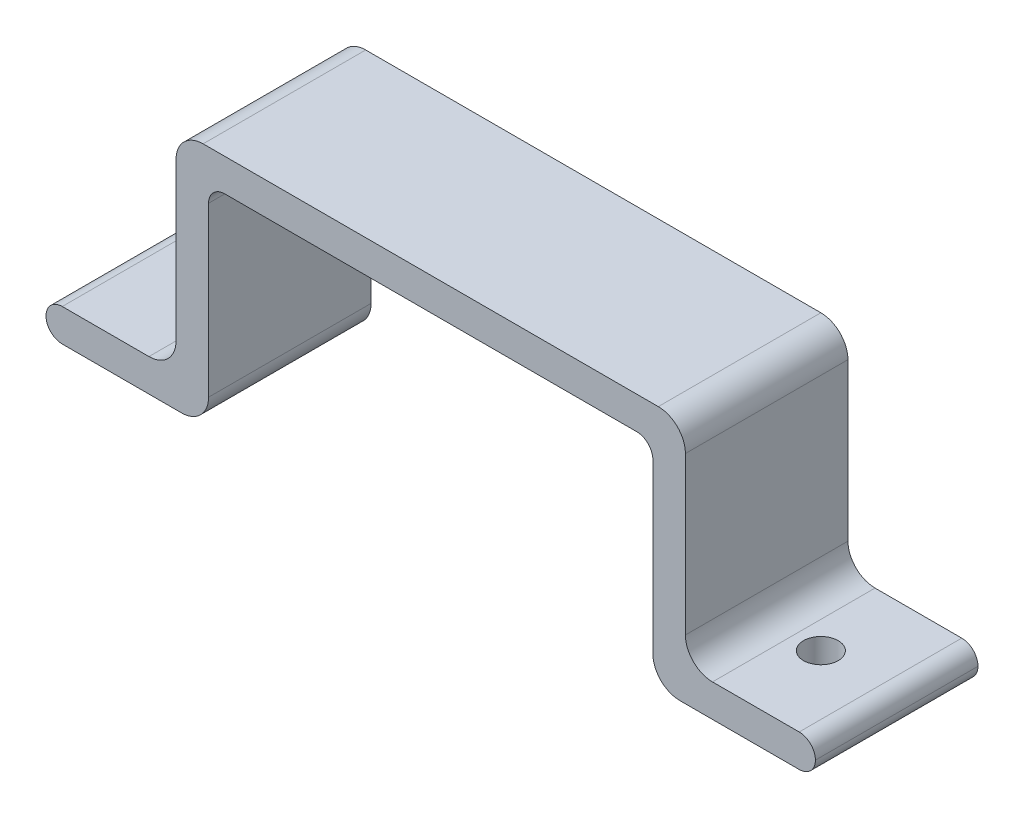
ISO-10303-21;
HEADER;
FILE_DESCRIPTION(('STEP AP214'),'2;1');
FILE_NAME('part.step','',(''),(''),'','','');
FILE_SCHEMA(('AUTOMOTIVE_DESIGN { 1 0 10303 214 1 1 1 1 }'));
ENDSEC;
DATA;
#1=APPLICATION_CONTEXT('core data for automotive mechanical design processes');
#2=APPLICATION_PROTOCOL_DEFINITION('international standard','automotive_design',2000,#1);
#3=PRODUCT_CONTEXT('',#1,'mechanical');
#4=PRODUCT('Part','Part','',(#3));
#5=PRODUCT_RELATED_PRODUCT_CATEGORY('part','',(#4));
#6=PRODUCT_DEFINITION_FORMATION('','',#4);
#7=PRODUCT_DEFINITION_CONTEXT('part definition',#1,'design');
#8=PRODUCT_DEFINITION('design','',#6,#7);
#9=PRODUCT_DEFINITION_SHAPE('','',#8);
#10=(LENGTH_UNIT() NAMED_UNIT(*) SI_UNIT(.MILLI.,.METRE.));
#11=(NAMED_UNIT(*) PLANE_ANGLE_UNIT() SI_UNIT($,.RADIAN.));
#12=(NAMED_UNIT(*) SI_UNIT($,.STERADIAN.) SOLID_ANGLE_UNIT());
#13=UNCERTAINTY_MEASURE_WITH_UNIT(LENGTH_MEASURE(1.E-05),#10,'distance_accuracy_value','');
#14=(GEOMETRIC_REPRESENTATION_CONTEXT(3) GLOBAL_UNCERTAINTY_ASSIGNED_CONTEXT((#13)) GLOBAL_UNIT_ASSIGNED_CONTEXT((#10,
#11,#12)) REPRESENTATION_CONTEXT('',''));
#15=CARTESIAN_POINT('',(0.,0.,0.));
#16=DIRECTION('',(0.,0.,1.));
#17=DIRECTION('',(1.,0.,0.));
#18=AXIS2_PLACEMENT_3D('',#15,#16,#17);
#19=CARTESIAN_POINT('',(23.5,12.75,7.5));
#20=DIRECTION('',(-1.,0.,0.));
#21=DIRECTION('',(0.,0.,1.));
#22=AXIS2_PLACEMENT_3D('',#19,#20,#21);
#23=PLANE('',#22);
#24=DIRECTION('',(0.,1.,0.));
#25=VECTOR('',#24,1.);
#26=CARTESIAN_POINT('',(23.5,12.75,-7.5));
#27=LINE('',#26,#25);
#28=CARTESIAN_POINT('',(23.5,-4.25,-7.5));
#29=VERTEX_POINT('',#28);
#30=CARTESIAN_POINT('',(23.5,10.25,-7.5));
#31=VERTEX_POINT('',#30);
#32=EDGE_CURVE('E231',#29,#31,#27,.T.);
#33=ORIENTED_EDGE('',*,*,#32,.T.);
#34=DIRECTION('',(0.,0.,-1.));
#35=VECTOR('',#34,1.);
#36=CARTESIAN_POINT('',(23.5,10.25,7.5));
#37=LINE('',#36,#35);
#38=CARTESIAN_POINT('',(23.5,10.25,7.5));
#39=VERTEX_POINT('',#38);
#40=EDGE_CURVE('E288',#31,#39,#37,.F.);
#41=ORIENTED_EDGE('',*,*,#40,.T.);
#42=DIRECTION('',(0.,1.,0.));
#43=VECTOR('',#42,1.);
#44=CARTESIAN_POINT('',(23.5,12.75,7.5));
#45=LINE('',#44,#43);
#46=CARTESIAN_POINT('',(23.5,-4.25,7.5));
#47=VERTEX_POINT('',#46);
#48=EDGE_CURVE('E254',#47,#39,#45,.T.);
#49=ORIENTED_EDGE('',*,*,#48,.F.);
#50=DIRECTION('',(0.,0.,-1.));
#51=VECTOR('',#50,1.);
#52=CARTESIAN_POINT('',(23.5,-4.25,-7.5));
#53=LINE('',#52,#51);
#54=EDGE_CURVE('E284',#47,#29,#53,.T.);
#55=ORIENTED_EDGE('',*,*,#54,.T.);
#56=EDGE_LOOP('',(#33,#41,#49,#55));
#57=FACE_BOUND('',#56,.T.);
#58=ADVANCED_FACE('F39',(#57),#23,.F.);
#59=CARTESIAN_POINT('',(-23.5,12.75,7.5));
#60=DIRECTION('',(0.,-1.,0.));
#61=DIRECTION('',(0.,0.,-1.));
#62=AXIS2_PLACEMENT_3D('',#59,#60,#61);
#63=PLANE('',#62);
#64=DIRECTION('',(-1.,0.,0.));
#65=VECTOR('',#64,1.);
#66=CARTESIAN_POINT('',(-23.5,12.75,-7.5));
#67=LINE('',#66,#65);
#68=CARTESIAN_POINT('',(21.,12.75,-7.5));
#69=VERTEX_POINT('',#68);
#70=CARTESIAN_POINT('',(-21.,12.75,-7.5));
#71=VERTEX_POINT('',#70);
#72=EDGE_CURVE('E224',#69,#71,#67,.T.);
#73=ORIENTED_EDGE('',*,*,#72,.T.);
#74=DIRECTION('',(0.,0.,-1.));
#75=VECTOR('',#74,1.);
#76=CARTESIAN_POINT('',(-21.,12.75,7.5));
#77=LINE('',#76,#75);
#78=CARTESIAN_POINT('',(-21.,12.75,7.5));
#79=VERTEX_POINT('',#78);
#80=EDGE_CURVE('E197',#71,#79,#77,.F.);
#81=ORIENTED_EDGE('',*,*,#80,.T.);
#82=DIRECTION('',(-1.,0.,0.));
#83=VECTOR('',#82,1.);
#84=CARTESIAN_POINT('',(-23.5,12.75,7.5));
#85=LINE('',#84,#83);
#86=CARTESIAN_POINT('',(21.,12.75,7.5));
#87=VERTEX_POINT('',#86);
#88=EDGE_CURVE('E418',#87,#79,#85,.T.);
#89=ORIENTED_EDGE('',*,*,#88,.F.);
#90=DIRECTION('',(0.,0.,-1.));
#91=VECTOR('',#90,1.);
#92=CARTESIAN_POINT('',(21.,12.75,7.5));
#93=LINE('',#92,#91);
#94=EDGE_CURVE('E203',#87,#69,#93,.T.);
#95=ORIENTED_EDGE('',*,*,#94,.T.);
#96=EDGE_LOOP('',(#73,#81,#89,#95));
#97=FACE_BOUND('',#96,.T.);
#98=ADVANCED_FACE('F473',(#97),#63,.F.);
#99=CARTESIAN_POINT('',(-23.5,-6.75,7.5));
#100=DIRECTION('',(1.,0.,0.));
#101=DIRECTION('',(0.,0.,-1.));
#102=AXIS2_PLACEMENT_3D('',#99,#100,#101);
#103=PLANE('',#102);
#104=DIRECTION('',(0.,-1.,0.));
#105=VECTOR('',#104,1.);
#106=CARTESIAN_POINT('',(-23.5,-6.75,7.5));
#107=LINE('',#106,#105);
#108=CARTESIAN_POINT('',(-23.5,10.25,7.5));
#109=VERTEX_POINT('',#108);
#110=CARTESIAN_POINT('',(-23.5,-4.25,7.5));
#111=VERTEX_POINT('',#110);
#112=EDGE_CURVE('E213',#109,#111,#107,.T.);
#113=ORIENTED_EDGE('',*,*,#112,.F.);
#114=DIRECTION('',(0.,0.,-1.));
#115=VECTOR('',#114,1.);
#116=CARTESIAN_POINT('',(-23.5,10.25,7.5));
#117=LINE('',#116,#115);
#118=CARTESIAN_POINT('',(-23.5,10.25,-7.5));
#119=VERTEX_POINT('',#118);
#120=EDGE_CURVE('E196',#109,#119,#117,.T.);
#121=ORIENTED_EDGE('',*,*,#120,.T.);
#122=DIRECTION('',(0.,-1.,0.));
#123=VECTOR('',#122,1.);
#124=CARTESIAN_POINT('',(-23.5,-6.75,-7.5));
#125=LINE('',#124,#123);
#126=CARTESIAN_POINT('',(-23.5,-4.25,-7.5));
#127=VERTEX_POINT('',#126);
#128=EDGE_CURVE('E210',#119,#127,#125,.T.);
#129=ORIENTED_EDGE('',*,*,#128,.T.);
#130=DIRECTION('',(0.,0.,-1.));
#131=VECTOR('',#130,1.);
#132=CARTESIAN_POINT('',(-23.5,-4.25,7.5));
#133=LINE('',#132,#131);
#134=EDGE_CURVE('E216',#127,#111,#133,.F.);
#135=ORIENTED_EDGE('',*,*,#134,.T.);
#136=EDGE_LOOP('',(#113,#121,#129,#135));
#137=FACE_BOUND('',#136,.T.);
#138=ADVANCED_FACE('F209',(#137),#103,.F.);
#139=CARTESIAN_POINT('',(-35.5,-6.75,7.5));
#140=DIRECTION('',(0.,-1.,0.));
#141=DIRECTION('',(1.,0.,0.));
#142=AXIS2_PLACEMENT_3D('',#139,#140,#141);
#143=PLANE('',#142);
#144=CARTESIAN_POINT('',(-28.5,-6.75000000000001,0.));
#145=DIRECTION('',(0.,1.,0.));
#146=DIRECTION('',(0.,0.,1.));
#147=AXIS2_PLACEMENT_3D('',#144,#145,#146);
#148=CIRCLE('',#147,1.6);
#149=CARTESIAN_POINT('',(-28.5,-6.75000000000001,1.6));
#150=VERTEX_POINT('',#149);
#151=EDGE_CURVE('E452',#150,#150,#148,.T.);
#152=ORIENTED_EDGE('',*,*,#151,.F.);
#153=EDGE_LOOP('',(#152));
#154=FACE_BOUND('',#153,.T.);
#155=DIRECTION('',(-1.,0.,0.));
#156=VECTOR('',#155,1.);
#157=CARTESIAN_POINT('',(-35.5,-6.75,-7.5));
#158=LINE('',#157,#156);
#159=CARTESIAN_POINT('',(-26.,-6.75,-7.5));
#160=VERTEX_POINT('',#159);
#161=CARTESIAN_POINT('',(-34.,-6.75,-7.5));
#162=VERTEX_POINT('',#161);
#163=EDGE_CURVE('E223',#160,#162,#158,.T.);
#164=ORIENTED_EDGE('',*,*,#163,.T.);
#165=DIRECTION('',(0.,0.,-1.));
#166=VECTOR('',#165,1.);
#167=CARTESIAN_POINT('',(-34.,-6.75,7.5));
#168=LINE('',#167,#166);
#169=CARTESIAN_POINT('',(-34.,-6.75,7.5));
#170=VERTEX_POINT('',#169);
#171=EDGE_CURVE('E374',#162,#170,#168,.F.);
#172=ORIENTED_EDGE('',*,*,#171,.T.);
#173=DIRECTION('',(-1.,0.,0.));
#174=VECTOR('',#173,1.);
#175=CARTESIAN_POINT('',(-35.5,-6.75,7.5));
#176=LINE('',#175,#174);
#177=CARTESIAN_POINT('',(-26.,-6.75,7.5));
#178=VERTEX_POINT('',#177);
#179=EDGE_CURVE('E411',#178,#170,#176,.T.);
#180=ORIENTED_EDGE('',*,*,#179,.F.);
#181=DIRECTION('',(0.,0.,-1.));
#182=VECTOR('',#181,1.);
#183=CARTESIAN_POINT('',(-26.,-6.75,-7.5));
#184=LINE('',#183,#182);
#185=EDGE_CURVE('E311',#178,#160,#184,.T.);
#186=ORIENTED_EDGE('',*,*,#185,.T.);
#187=EDGE_LOOP('',(#164,#172,#180,#186));
#188=FACE_BOUND('',#187,.T.);
#189=ADVANCED_FACE('F407',(#154,#188),#143,.F.);
#190=CARTESIAN_POINT('',(-20.5,-9.75,7.5));
#191=DIRECTION('',(0.,1.,0.));
#192=DIRECTION('',(-1.,0.,0.));
#193=AXIS2_PLACEMENT_3D('',#190,#191,#192);
#194=PLANE('',#193);
#195=CARTESIAN_POINT('',(-28.5,-9.75,0.));
#196=DIRECTION('',(0.,1.,0.));
#197=DIRECTION('',(0.,0.,1.));
#198=AXIS2_PLACEMENT_3D('',#195,#196,#197);
#199=CIRCLE('',#198,1.6);
#200=CARTESIAN_POINT('',(-28.5,-9.75,1.6));
#201=VERTEX_POINT('',#200);
#202=EDGE_CURVE('E446',#201,#201,#199,.T.);
#203=ORIENTED_EDGE('',*,*,#202,.T.);
#204=EDGE_LOOP('',(#203));
#205=FACE_BOUND('',#204,.T.);
#206=DIRECTION('',(1.,0.,0.));
#207=VECTOR('',#206,1.);
#208=CARTESIAN_POINT('',(-20.5,-9.75,7.5));
#209=LINE('',#208,#207);
#210=CARTESIAN_POINT('',(-34.,-9.75,7.5));
#211=VERTEX_POINT('',#210);
#212=CARTESIAN_POINT('',(-23.,-9.75,7.5));
#213=VERTEX_POINT('',#212);
#214=EDGE_CURVE('E422',#211,#213,#209,.T.);
#215=ORIENTED_EDGE('',*,*,#214,.F.);
#216=DIRECTION('',(0.,0.,-1.));
#217=VECTOR('',#216,1.);
#218=CARTESIAN_POINT('',(-34.,-9.75,7.5));
#219=LINE('',#218,#217);
#220=CARTESIAN_POINT('',(-34.,-9.75,-7.5));
#221=VERTEX_POINT('',#220);
#222=EDGE_CURVE('E370',#211,#221,#219,.T.);
#223=ORIENTED_EDGE('',*,*,#222,.T.);
#224=DIRECTION('',(1.,0.,0.));
#225=VECTOR('',#224,1.);
#226=CARTESIAN_POINT('',(-20.5,-9.75,-7.5));
#227=LINE('',#226,#225);
#228=CARTESIAN_POINT('',(-23.,-9.75,-7.5));
#229=VERTEX_POINT('',#228);
#230=EDGE_CURVE('E229',#221,#229,#227,.T.);
#231=ORIENTED_EDGE('',*,*,#230,.T.);
#232=DIRECTION('',(0.,0.,-1.));
#233=VECTOR('',#232,1.);
#234=CARTESIAN_POINT('',(-23.,-9.75,7.5));
#235=LINE('',#234,#233);
#236=EDGE_CURVE('E307',#229,#213,#235,.F.);
#237=ORIENTED_EDGE('',*,*,#236,.T.);
#238=EDGE_LOOP('',(#215,#223,#231,#237));
#239=FACE_BOUND('',#238,.T.);
#240=ADVANCED_FACE('F550',(#205,#239),#194,.F.);
#241=CARTESIAN_POINT('',(-20.5,9.75,7.5));
#242=DIRECTION('',(-1.,0.,0.));
#243=DIRECTION('',(0.,0.,1.));
#244=AXIS2_PLACEMENT_3D('',#241,#242,#243);
#245=PLANE('',#244);
#246=DIRECTION('',(0.,1.,0.));
#247=VECTOR('',#246,1.);
#248=CARTESIAN_POINT('',(-20.5,9.75,-7.5));
#249=LINE('',#248,#247);
#250=CARTESIAN_POINT('',(-20.5,-7.25,-7.5));
#251=VERTEX_POINT('',#250);
#252=CARTESIAN_POINT('',(-20.5,8.25,-7.5));
#253=VERTEX_POINT('',#252);
#254=EDGE_CURVE('E237',#251,#253,#249,.T.);
#255=ORIENTED_EDGE('',*,*,#254,.T.);
#256=DIRECTION('',(0.,0.,-1.));
#257=VECTOR('',#256,1.);
#258=CARTESIAN_POINT('',(-20.5,8.25,7.5));
#259=LINE('',#258,#257);
#260=CARTESIAN_POINT('',(-20.5,8.25,7.5));
#261=VERTEX_POINT('',#260);
#262=EDGE_CURVE('E367',#253,#261,#259,.F.);
#263=ORIENTED_EDGE('',*,*,#262,.T.);
#264=DIRECTION('',(0.,1.,0.));
#265=VECTOR('',#264,1.);
#266=CARTESIAN_POINT('',(-20.5,9.75,7.5));
#267=LINE('',#266,#265);
#268=CARTESIAN_POINT('',(-20.5,-7.25,7.5));
#269=VERTEX_POINT('',#268);
#270=EDGE_CURVE('E429',#269,#261,#267,.T.);
#271=ORIENTED_EDGE('',*,*,#270,.F.);
#272=DIRECTION('',(0.,0.,-1.));
#273=VECTOR('',#272,1.);
#274=CARTESIAN_POINT('',(-20.5,-7.25,7.5));
#275=LINE('',#274,#273);
#276=EDGE_CURVE('E303',#269,#251,#275,.T.);
#277=ORIENTED_EDGE('',*,*,#276,.T.);
#278=EDGE_LOOP('',(#255,#263,#271,#277));
#279=FACE_BOUND('',#278,.T.);
#280=ADVANCED_FACE('F527',(#279),#245,.F.);
#281=CARTESIAN_POINT('',(20.5,9.75,7.5));
#282=DIRECTION('',(0.,1.,0.));
#283=DIRECTION('',(0.,0.,1.));
#284=AXIS2_PLACEMENT_3D('',#281,#282,#283);
#285=PLANE('',#284);
#286=DIRECTION('',(1.,0.,0.));
#287=VECTOR('',#286,1.);
#288=CARTESIAN_POINT('',(20.5,9.75,-7.5));
#289=LINE('',#288,#287);
#290=CARTESIAN_POINT('',(-19.,9.75,-7.5));
#291=VERTEX_POINT('',#290);
#292=CARTESIAN_POINT('',(19.,9.75,-7.5));
#293=VERTEX_POINT('',#292);
#294=EDGE_CURVE('E241',#291,#293,#289,.T.);
#295=ORIENTED_EDGE('',*,*,#294,.T.);
#296=DIRECTION('',(0.,0.,-1.));
#297=VECTOR('',#296,1.);
#298=CARTESIAN_POINT('',(19.,9.75,7.5));
#299=LINE('',#298,#297);
#300=CARTESIAN_POINT('',(19.,9.75,7.5));
#301=VERTEX_POINT('',#300);
#302=EDGE_CURVE('E364',#293,#301,#299,.F.);
#303=ORIENTED_EDGE('',*,*,#302,.T.);
#304=DIRECTION('',(1.,0.,0.));
#305=VECTOR('',#304,1.);
#306=CARTESIAN_POINT('',(20.5,9.75,7.5));
#307=LINE('',#306,#305);
#308=CARTESIAN_POINT('',(-19.,9.75,7.5));
#309=VERTEX_POINT('',#308);
#310=EDGE_CURVE('E433',#309,#301,#307,.T.);
#311=ORIENTED_EDGE('',*,*,#310,.F.);
#312=DIRECTION('',(0.,0.,-1.));
#313=VECTOR('',#312,1.);
#314=CARTESIAN_POINT('',(-19.,9.75,-7.5));
#315=LINE('',#314,#313);
#316=EDGE_CURVE('E360',#309,#291,#315,.T.);
#317=ORIENTED_EDGE('',*,*,#316,.T.);
#318=EDGE_LOOP('',(#295,#303,#311,#317));
#319=FACE_BOUND('',#318,.T.);
#320=ADVANCED_FACE('F536',(#319),#285,.F.);
#321=CARTESIAN_POINT('',(20.5,-9.75,7.5));
#322=DIRECTION('',(1.,0.,0.));
#323=DIRECTION('',(0.,1.,0.));
#324=AXIS2_PLACEMENT_3D('',#321,#322,#323);
#325=PLANE('',#324);
#326=DIRECTION('',(0.,-1.,0.));
#327=VECTOR('',#326,1.);
#328=CARTESIAN_POINT('',(20.5,-9.75,7.5));
#329=LINE('',#328,#327);
#330=CARTESIAN_POINT('',(20.5,8.25,7.5));
#331=VERTEX_POINT('',#330);
#332=CARTESIAN_POINT('',(20.5,-7.25,7.5));
#333=VERTEX_POINT('',#332);
#334=EDGE_CURVE('E437',#331,#333,#329,.T.);
#335=ORIENTED_EDGE('',*,*,#334,.F.);
#336=DIRECTION('',(0.,0.,-1.));
#337=VECTOR('',#336,1.);
#338=CARTESIAN_POINT('',(20.5,8.25,-7.5));
#339=LINE('',#338,#337);
#340=CARTESIAN_POINT('',(20.5,8.25,-7.5));
#341=VERTEX_POINT('',#340);
#342=EDGE_CURVE('E356',#331,#341,#339,.T.);
#343=ORIENTED_EDGE('',*,*,#342,.T.);
#344=DIRECTION('',(0.,-1.,0.));
#345=VECTOR('',#344,1.);
#346=CARTESIAN_POINT('',(20.5,-9.75,-7.5));
#347=LINE('',#346,#345);
#348=CARTESIAN_POINT('',(20.5,-7.25,-7.5));
#349=VERTEX_POINT('',#348);
#350=EDGE_CURVE('E245',#341,#349,#347,.T.);
#351=ORIENTED_EDGE('',*,*,#350,.T.);
#352=DIRECTION('',(0.,0.,-1.));
#353=VECTOR('',#352,1.);
#354=CARTESIAN_POINT('',(20.5,-7.25,7.5));
#355=LINE('',#354,#353);
#356=EDGE_CURVE('E295',#349,#333,#355,.F.);
#357=ORIENTED_EDGE('',*,*,#356,.T.);
#358=EDGE_LOOP('',(#335,#343,#351,#357));
#359=FACE_BOUND('',#358,.T.);
#360=ADVANCED_FACE('F543',(#359),#325,.F.);
#361=CARTESIAN_POINT('',(35.5,-9.75,7.5));
#362=DIRECTION('',(0.,1.,0.));
#363=DIRECTION('',(-1.,0.,0.));
#364=AXIS2_PLACEMENT_3D('',#361,#362,#363);
#365=PLANE('',#364);
#366=CARTESIAN_POINT('',(28.5,-9.75,0.));
#367=DIRECTION('',(0.,1.,0.));
#368=DIRECTION('',(0.,0.,1.));
#369=AXIS2_PLACEMENT_3D('',#366,#367,#368);
#370=CIRCLE('',#369,1.6);
#371=CARTESIAN_POINT('',(28.5,-9.75,1.6));
#372=VERTEX_POINT('',#371);
#373=EDGE_CURVE('E393',#372,#372,#370,.T.);
#374=ORIENTED_EDGE('',*,*,#373,.T.);
#375=EDGE_LOOP('',(#374));
#376=FACE_BOUND('',#375,.T.);
#377=DIRECTION('',(1.,0.,0.));
#378=VECTOR('',#377,1.);
#379=CARTESIAN_POINT('',(35.5,-9.75,-7.5));
#380=LINE('',#379,#378);
#381=CARTESIAN_POINT('',(23.,-9.75,-7.5));
#382=VERTEX_POINT('',#381);
#383=CARTESIAN_POINT('',(34.,-9.75,-7.5));
#384=VERTEX_POINT('',#383);
#385=EDGE_CURVE('E248',#382,#384,#380,.T.);
#386=ORIENTED_EDGE('',*,*,#385,.T.);
#387=DIRECTION('',(0.,0.,-1.));
#388=VECTOR('',#387,1.);
#389=CARTESIAN_POINT('',(34.,-9.75,7.5));
#390=LINE('',#389,#388);
#391=CARTESIAN_POINT('',(34.,-9.75,7.5));
#392=VERTEX_POINT('',#391);
#393=EDGE_CURVE('E65',#384,#392,#390,.F.);
#394=ORIENTED_EDGE('',*,*,#393,.T.);
#395=DIRECTION('',(1.,0.,0.));
#396=VECTOR('',#395,1.);
#397=CARTESIAN_POINT('',(35.5,-9.75,7.5));
#398=LINE('',#397,#396);
#399=CARTESIAN_POINT('',(23.,-9.75,7.5));
#400=VERTEX_POINT('',#399);
#401=EDGE_CURVE('E440',#400,#392,#398,.T.);
#402=ORIENTED_EDGE('',*,*,#401,.F.);
#403=DIRECTION('',(0.,0.,-1.));
#404=VECTOR('',#403,1.);
#405=CARTESIAN_POINT('',(23.,-9.75,7.5));
#406=LINE('',#405,#404);
#407=EDGE_CURVE('E291',#400,#382,#406,.T.);
#408=ORIENTED_EDGE('',*,*,#407,.T.);
#409=EDGE_LOOP('',(#386,#394,#402,#408));
#410=FACE_BOUND('',#409,.T.);
#411=ADVANCED_FACE('F548',(#376,#410),#365,.F.);
#412=CARTESIAN_POINT('',(23.5,-6.75,7.5));
#413=DIRECTION('',(0.,-1.,0.));
#414=DIRECTION('',(1.,0.,0.));
#415=AXIS2_PLACEMENT_3D('',#412,#413,#414);
#416=PLANE('',#415);
#417=CARTESIAN_POINT('',(28.5,-6.75000000000001,0.));
#418=DIRECTION('',(0.,1.,0.));
#419=DIRECTION('',(0.,0.,1.));
#420=AXIS2_PLACEMENT_3D('',#417,#418,#419);
#421=CIRCLE('',#420,1.6);
#422=CARTESIAN_POINT('',(28.5,-6.75000000000001,1.6));
#423=VERTEX_POINT('',#422);
#424=EDGE_CURVE('E387',#423,#423,#421,.T.);
#425=ORIENTED_EDGE('',*,*,#424,.F.);
#426=EDGE_LOOP('',(#425));
#427=FACE_BOUND('',#426,.T.);
#428=DIRECTION('',(-1.,0.,0.));
#429=VECTOR('',#428,1.);
#430=CARTESIAN_POINT('',(23.5,-6.75,7.5));
#431=LINE('',#430,#429);
#432=CARTESIAN_POINT('',(34.,-6.75,7.5));
#433=VERTEX_POINT('',#432);
#434=CARTESIAN_POINT('',(26.,-6.75,7.5));
#435=VERTEX_POINT('',#434);
#436=EDGE_CURVE('E256',#433,#435,#431,.T.);
#437=ORIENTED_EDGE('',*,*,#436,.F.);
#438=DIRECTION('',(0.,0.,-1.));
#439=VECTOR('',#438,1.);
#440=CARTESIAN_POINT('',(34.,-6.75,7.5));
#441=LINE('',#440,#439);
#442=CARTESIAN_POINT('',(34.,-6.75,-7.5));
#443=VERTEX_POINT('',#442);
#444=EDGE_CURVE('E327',#433,#443,#441,.T.);
#445=ORIENTED_EDGE('',*,*,#444,.T.);
#446=DIRECTION('',(-1.,0.,0.));
#447=VECTOR('',#446,1.);
#448=CARTESIAN_POINT('',(23.5,-6.75,-7.5));
#449=LINE('',#448,#447);
#450=CARTESIAN_POINT('',(26.,-6.75,-7.5));
#451=VERTEX_POINT('',#450);
#452=EDGE_CURVE('E251',#443,#451,#449,.T.);
#453=ORIENTED_EDGE('',*,*,#452,.T.);
#454=DIRECTION('',(0.,0.,-1.));
#455=VECTOR('',#454,1.);
#456=CARTESIAN_POINT('',(26.,-6.75,7.5));
#457=LINE('',#456,#455);
#458=EDGE_CURVE('E299',#451,#435,#457,.F.);
#459=ORIENTED_EDGE('',*,*,#458,.T.);
#460=EDGE_LOOP('',(#437,#445,#453,#459));
#461=FACE_BOUND('',#460,.T.);
#462=ADVANCED_FACE('F479',(#427,#461),#416,.F.);
#463=CARTESIAN_POINT('',(0.,0.,7.5));
#464=DIRECTION('',(0.,0.,1.));
#465=DIRECTION('',(1.,0.,0.));
#466=AXIS2_PLACEMENT_3D('',#463,#464,#465);
#467=PLANE('',#466);
#468=CARTESIAN_POINT('',(34.,-8.25,7.5));
#469=DIRECTION('',(0.,0.,1.));
#470=DIRECTION('',(1.,0.,0.));
#471=AXIS2_PLACEMENT_3D('',#468,#469,#470);
#472=CIRCLE('',#471,1.5);
#473=CARTESIAN_POINT('',(35.5,-8.25,7.5));
#474=VERTEX_POINT('',#473);
#475=EDGE_CURVE('E57',#392,#474,#472,.T.);
#476=ORIENTED_EDGE('',*,*,#475,.T.);
#477=CARTESIAN_POINT('',(34.,-8.25,7.5));
#478=DIRECTION('',(0.,0.,1.));
#479=DIRECTION('',(1.,0.,0.));
#480=AXIS2_PLACEMENT_3D('',#477,#478,#479);
#481=CIRCLE('',#480,1.5);
#482=EDGE_CURVE('E351',#474,#433,#481,.T.);
#483=ORIENTED_EDGE('',*,*,#482,.T.);
#484=ORIENTED_EDGE('',*,*,#436,.T.);
#485=CARTESIAN_POINT('',(26.,-4.25,7.5));
#486=DIRECTION('',(0.,0.,1.));
#487=DIRECTION('',(1.,0.,0.));
#488=AXIS2_PLACEMENT_3D('',#485,#486,#487);
#489=CIRCLE('',#488,2.5);
#490=EDGE_CURVE('E319',#435,#47,#489,.F.);
#491=ORIENTED_EDGE('',*,*,#490,.T.);
#492=ORIENTED_EDGE('',*,*,#48,.T.);
#493=CARTESIAN_POINT('',(21.,10.25,7.5));
#494=DIRECTION('',(0.,0.,1.));
#495=DIRECTION('',(1.,0.,0.));
#496=AXIS2_PLACEMENT_3D('',#493,#494,#495);
#497=CIRCLE('',#496,2.5);
#498=EDGE_CURVE('E278',#39,#87,#497,.T.);
#499=ORIENTED_EDGE('',*,*,#498,.T.);
#500=ORIENTED_EDGE('',*,*,#88,.T.);
#501=CARTESIAN_POINT('',(-21.,10.25,7.5));
#502=DIRECTION('',(0.,0.,1.));
#503=DIRECTION('',(1.,0.,0.));
#504=AXIS2_PLACEMENT_3D('',#501,#502,#503);
#505=CIRCLE('',#504,2.5);
#506=EDGE_CURVE('E281',#79,#109,#505,.T.);
#507=ORIENTED_EDGE('',*,*,#506,.T.);
#508=ORIENTED_EDGE('',*,*,#112,.T.);
#509=CARTESIAN_POINT('',(-26.,-4.25,7.5));
#510=DIRECTION('',(0.,0.,1.));
#511=DIRECTION('',(1.,0.,0.));
#512=AXIS2_PLACEMENT_3D('',#509,#510,#511);
#513=CIRCLE('',#512,2.5);
#514=EDGE_CURVE('E324',#111,#178,#513,.F.);
#515=ORIENTED_EDGE('',*,*,#514,.T.);
#516=ORIENTED_EDGE('',*,*,#179,.T.);
#517=CARTESIAN_POINT('',(-34.,-8.24999999999999,7.5));
#518=DIRECTION('',(0.,0.,1.));
#519=DIRECTION('',(1.,0.,0.));
#520=AXIS2_PLACEMENT_3D('',#517,#518,#519);
#521=CIRCLE('',#520,1.5);
#522=CARTESIAN_POINT('',(-35.5,-8.24999999999999,7.5));
#523=VERTEX_POINT('',#522);
#524=EDGE_CURVE('E343',#170,#523,#521,.T.);
#525=ORIENTED_EDGE('',*,*,#524,.T.);
#526=CARTESIAN_POINT('',(-34.,-8.25,7.5));
#527=DIRECTION('',(0.,0.,1.));
#528=DIRECTION('',(1.,0.,0.));
#529=AXIS2_PLACEMENT_3D('',#526,#527,#528);
#530=CIRCLE('',#529,1.5);
#531=EDGE_CURVE('E346',#523,#211,#530,.T.);
#532=ORIENTED_EDGE('',*,*,#531,.T.);
#533=ORIENTED_EDGE('',*,*,#214,.T.);
#534=CARTESIAN_POINT('',(-23.,-7.25,7.5));
#535=DIRECTION('',(0.,0.,1.));
#536=DIRECTION('',(1.,0.,0.));
#537=AXIS2_PLACEMENT_3D('',#534,#535,#536);
#538=CIRCLE('',#537,2.5);
#539=EDGE_CURVE('E272',#213,#269,#538,.T.);
#540=ORIENTED_EDGE('',*,*,#539,.T.);
#541=ORIENTED_EDGE('',*,*,#270,.T.);
#542=CARTESIAN_POINT('',(-19.,8.25,7.5));
#543=DIRECTION('',(0.,0.,1.));
#544=DIRECTION('',(1.,0.,0.));
#545=AXIS2_PLACEMENT_3D('',#542,#543,#544);
#546=CIRCLE('',#545,1.5);
#547=EDGE_CURVE('E11',#261,#309,#546,.F.);
#548=ORIENTED_EDGE('',*,*,#547,.T.);
#549=ORIENTED_EDGE('',*,*,#310,.T.);
#550=CARTESIAN_POINT('',(19.,8.25,7.5));
#551=DIRECTION('',(0.,0.,1.));
#552=DIRECTION('',(1.,0.,0.));
#553=AXIS2_PLACEMENT_3D('',#550,#551,#552);
#554=CIRCLE('',#553,1.5);
#555=EDGE_CURVE('E380',#301,#331,#554,.F.);
#556=ORIENTED_EDGE('',*,*,#555,.T.);
#557=ORIENTED_EDGE('',*,*,#334,.T.);
#558=CARTESIAN_POINT('',(23.,-7.25,7.5));
#559=DIRECTION('',(0.,0.,1.));
#560=DIRECTION('',(1.,0.,0.));
#561=AXIS2_PLACEMENT_3D('',#558,#559,#560);
#562=CIRCLE('',#561,2.5);
#563=EDGE_CURVE('E275',#333,#400,#562,.T.);
#564=ORIENTED_EDGE('',*,*,#563,.T.);
#565=ORIENTED_EDGE('',*,*,#401,.T.);
#566=EDGE_LOOP('',(#476,#483,#484,#491,#492,#499,#500,#507,#508,#515,#516,#525,#532,#533,#540,
#541,#548,#549,#556,#557,#564,#565));
#567=FACE_BOUND('',#566,.T.);
#568=ADVANCED_FACE('F415',(#567),#467,.T.);
#569=CARTESIAN_POINT('',(0.,0.,-7.5));
#570=DIRECTION('',(0.,0.,1.));
#571=DIRECTION('',(1.,0.,0.));
#572=AXIS2_PLACEMENT_3D('',#569,#570,#571);
#573=PLANE('',#572);
#574=ORIENTED_EDGE('',*,*,#452,.F.);
#575=CARTESIAN_POINT('',(34.,-8.25,-7.5));
#576=DIRECTION('',(0.,0.,1.));
#577=DIRECTION('',(1.,0.,0.));
#578=AXIS2_PLACEMENT_3D('',#575,#576,#577);
#579=CIRCLE('',#578,1.5);
#580=CARTESIAN_POINT('',(35.5,-8.25,-7.5));
#581=VERTEX_POINT('',#580);
#582=EDGE_CURVE('E340',#443,#581,#579,.F.);
#583=ORIENTED_EDGE('',*,*,#582,.T.);
#584=CARTESIAN_POINT('',(34.,-8.25,-7.5));
#585=DIRECTION('',(0.,0.,1.));
#586=DIRECTION('',(1.,0.,0.));
#587=AXIS2_PLACEMENT_3D('',#584,#585,#586);
#588=CIRCLE('',#587,1.5);
#589=EDGE_CURVE('E337',#581,#384,#588,.F.);
#590=ORIENTED_EDGE('',*,*,#589,.T.);
#591=ORIENTED_EDGE('',*,*,#385,.F.);
#592=CARTESIAN_POINT('',(23.,-7.25,-7.5));
#593=DIRECTION('',(0.,0.,1.));
#594=DIRECTION('',(1.,0.,0.));
#595=AXIS2_PLACEMENT_3D('',#592,#593,#594);
#596=CIRCLE('',#595,2.5);
#597=EDGE_CURVE('E261',#382,#349,#596,.F.);
#598=ORIENTED_EDGE('',*,*,#597,.T.);
#599=ORIENTED_EDGE('',*,*,#350,.F.);
#600=CARTESIAN_POINT('',(19.,8.25,-7.5));
#601=DIRECTION('',(0.,0.,1.));
#602=DIRECTION('',(1.,0.,0.));
#603=AXIS2_PLACEMENT_3D('',#600,#601,#602);
#604=CIRCLE('',#603,1.5);
#605=EDGE_CURVE('E377',#341,#293,#604,.T.);
#606=ORIENTED_EDGE('',*,*,#605,.T.);
#607=ORIENTED_EDGE('',*,*,#294,.F.);
#608=CARTESIAN_POINT('',(-19.,8.25,-7.5));
#609=DIRECTION('',(0.,0.,1.));
#610=DIRECTION('',(1.,0.,0.));
#611=AXIS2_PLACEMENT_3D('',#608,#609,#610);
#612=CIRCLE('',#611,1.5);
#613=EDGE_CURVE('E49',#291,#253,#612,.T.);
#614=ORIENTED_EDGE('',*,*,#613,.T.);
#615=ORIENTED_EDGE('',*,*,#254,.F.);
#616=CARTESIAN_POINT('',(-23.,-7.25,-7.5));
#617=DIRECTION('',(0.,0.,1.));
#618=DIRECTION('',(1.,0.,0.));
#619=AXIS2_PLACEMENT_3D('',#616,#617,#618);
#620=CIRCLE('',#619,2.5);
#621=EDGE_CURVE('E215',#251,#229,#620,.F.);
#622=ORIENTED_EDGE('',*,*,#621,.T.);
#623=ORIENTED_EDGE('',*,*,#230,.F.);
#624=CARTESIAN_POINT('',(-34.,-8.25,-7.5));
#625=DIRECTION('',(0.,0.,1.));
#626=DIRECTION('',(1.,0.,0.));
#627=AXIS2_PLACEMENT_3D('',#624,#625,#626);
#628=CIRCLE('',#627,1.5);
#629=CARTESIAN_POINT('',(-35.5,-8.24999999999999,-7.5));
#630=VERTEX_POINT('',#629);
#631=EDGE_CURVE('E334',#221,#630,#628,.F.);
#632=ORIENTED_EDGE('',*,*,#631,.T.);
#633=CARTESIAN_POINT('',(-34.,-8.24999999999999,-7.5));
#634=DIRECTION('',(0.,0.,1.));
#635=DIRECTION('',(1.,0.,0.));
#636=AXIS2_PLACEMENT_3D('',#633,#634,#635);
#637=CIRCLE('',#636,1.5);
#638=EDGE_CURVE('E331',#630,#162,#637,.F.);
#639=ORIENTED_EDGE('',*,*,#638,.T.);
#640=ORIENTED_EDGE('',*,*,#163,.F.);
#641=CARTESIAN_POINT('',(-26.,-4.25,-7.5));
#642=DIRECTION('',(0.,0.,1.));
#643=DIRECTION('',(1.,0.,0.));
#644=AXIS2_PLACEMENT_3D('',#641,#642,#643);
#645=CIRCLE('',#644,2.5);
#646=EDGE_CURVE('E221',#160,#127,#645,.T.);
#647=ORIENTED_EDGE('',*,*,#646,.T.);
#648=ORIENTED_EDGE('',*,*,#128,.F.);
#649=CARTESIAN_POINT('',(-21.,10.25,-7.5));
#650=DIRECTION('',(0.,0.,1.));
#651=DIRECTION('',(1.,0.,0.));
#652=AXIS2_PLACEMENT_3D('',#649,#650,#651);
#653=CIRCLE('',#652,2.5);
#654=EDGE_CURVE('E192',#119,#71,#653,.F.);
#655=ORIENTED_EDGE('',*,*,#654,.T.);
#656=ORIENTED_EDGE('',*,*,#72,.F.);
#657=CARTESIAN_POINT('',(21.,10.25,-7.5));
#658=DIRECTION('',(0.,0.,1.));
#659=DIRECTION('',(1.,0.,0.));
#660=AXIS2_PLACEMENT_3D('',#657,#658,#659);
#661=CIRCLE('',#660,2.5);
#662=EDGE_CURVE('E204',#69,#31,#661,.F.);
#663=ORIENTED_EDGE('',*,*,#662,.T.);
#664=ORIENTED_EDGE('',*,*,#32,.F.);
#665=CARTESIAN_POINT('',(26.,-4.25,-7.5));
#666=DIRECTION('',(0.,0.,1.));
#667=DIRECTION('',(1.,0.,0.));
#668=AXIS2_PLACEMENT_3D('',#665,#666,#667);
#669=CIRCLE('',#668,2.5);
#670=EDGE_CURVE('E315',#29,#451,#669,.T.);
#671=ORIENTED_EDGE('',*,*,#670,.T.);
#672=EDGE_LOOP('',(#574,#583,#590,#591,#598,#599,#606,#607,#614,#615,#622,#623,#632,#639,#640,
#647,#648,#655,#656,#663,#664,#671));
#673=FACE_BOUND('',#672,.T.);
#674=ADVANCED_FACE('F219',(#673),#573,.F.);
#675=CARTESIAN_POINT('',(28.5,-9.75,0.));
#676=DIRECTION('',(0.,1.,0.));
#677=DIRECTION('',(0.,0.,1.));
#678=AXIS2_PLACEMENT_3D('',#675,#676,#677);
#679=CYLINDRICAL_SURFACE('',#678,1.6);
#680=ORIENTED_EDGE('',*,*,#373,.F.);
#681=EDGE_LOOP('',(#680));
#682=FACE_BOUND('',#681,.T.);
#683=ORIENTED_EDGE('',*,*,#424,.T.);
#684=EDGE_LOOP('',(#683));
#685=FACE_BOUND('',#684,.T.);
#686=ADVANCED_FACE('F633',(#682,#685),#679,.F.);
#687=CARTESIAN_POINT('',(-28.5,-9.75,0.));
#688=DIRECTION('',(0.,1.,0.));
#689=DIRECTION('',(0.,0.,1.));
#690=AXIS2_PLACEMENT_3D('',#687,#688,#689);
#691=CYLINDRICAL_SURFACE('',#690,1.6);
#692=ORIENTED_EDGE('',*,*,#202,.F.);
#693=EDGE_LOOP('',(#692));
#694=FACE_BOUND('',#693,.T.);
#695=ORIENTED_EDGE('',*,*,#151,.T.);
#696=EDGE_LOOP('',(#695));
#697=FACE_BOUND('',#696,.T.);
#698=ADVANCED_FACE('F507',(#694,#697),#691,.F.);
#699=CARTESIAN_POINT('',(-21.,10.25,7.5));
#700=DIRECTION('',(0.,0.,-1.));
#701=DIRECTION('',(-1.,0.,0.));
#702=AXIS2_PLACEMENT_3D('',#699,#700,#701);
#703=CYLINDRICAL_SURFACE('',#702,2.5);
#704=ORIENTED_EDGE('',*,*,#506,.F.);
#705=ORIENTED_EDGE('',*,*,#80,.F.);
#706=ORIENTED_EDGE('',*,*,#654,.F.);
#707=ORIENTED_EDGE('',*,*,#120,.F.);
#708=EDGE_LOOP('',(#704,#705,#706,#707));
#709=FACE_BOUND('',#708,.T.);
#710=ADVANCED_FACE('F195',(#709),#703,.T.);
#711=CARTESIAN_POINT('',(21.,10.25,7.5));
#712=DIRECTION('',(0.,0.,-1.));
#713=DIRECTION('',(-1.,0.,0.));
#714=AXIS2_PLACEMENT_3D('',#711,#712,#713);
#715=CYLINDRICAL_SURFACE('',#714,2.5);
#716=ORIENTED_EDGE('',*,*,#498,.F.);
#717=ORIENTED_EDGE('',*,*,#40,.F.);
#718=ORIENTED_EDGE('',*,*,#662,.F.);
#719=ORIENTED_EDGE('',*,*,#94,.F.);
#720=EDGE_LOOP('',(#716,#717,#718,#719));
#721=FACE_BOUND('',#720,.T.);
#722=ADVANCED_FACE('F471',(#721),#715,.T.);
#723=CARTESIAN_POINT('',(23.,-7.25,7.5));
#724=DIRECTION('',(0.,0.,-1.));
#725=DIRECTION('',(-1.,0.,0.));
#726=AXIS2_PLACEMENT_3D('',#723,#724,#725);
#727=CYLINDRICAL_SURFACE('',#726,2.5);
#728=ORIENTED_EDGE('',*,*,#563,.F.);
#729=ORIENTED_EDGE('',*,*,#356,.F.);
#730=ORIENTED_EDGE('',*,*,#597,.F.);
#731=ORIENTED_EDGE('',*,*,#407,.F.);
#732=EDGE_LOOP('',(#728,#729,#730,#731));
#733=FACE_BOUND('',#732,.T.);
#734=ADVANCED_FACE('F510',(#733),#727,.T.);
#735=CARTESIAN_POINT('',(26.,-4.25,7.5));
#736=DIRECTION('',(0.,0.,1.));
#737=DIRECTION('',(1.,0.,0.));
#738=AXIS2_PLACEMENT_3D('',#735,#736,#737);
#739=CYLINDRICAL_SURFACE('',#738,2.5);
#740=ORIENTED_EDGE('',*,*,#490,.F.);
#741=ORIENTED_EDGE('',*,*,#458,.F.);
#742=ORIENTED_EDGE('',*,*,#670,.F.);
#743=ORIENTED_EDGE('',*,*,#54,.F.);
#744=EDGE_LOOP('',(#740,#741,#742,#743));
#745=FACE_BOUND('',#744,.T.);
#746=ADVANCED_FACE('F476',(#745),#739,.F.);
#747=CARTESIAN_POINT('',(-23.,-7.25,7.5));
#748=DIRECTION('',(0.,0.,-1.));
#749=DIRECTION('',(-1.,0.,0.));
#750=AXIS2_PLACEMENT_3D('',#747,#748,#749);
#751=CYLINDRICAL_SURFACE('',#750,2.5);
#752=ORIENTED_EDGE('',*,*,#539,.F.);
#753=ORIENTED_EDGE('',*,*,#236,.F.);
#754=ORIENTED_EDGE('',*,*,#621,.F.);
#755=ORIENTED_EDGE('',*,*,#276,.F.);
#756=EDGE_LOOP('',(#752,#753,#754,#755));
#757=FACE_BOUND('',#756,.T.);
#758=ADVANCED_FACE('F494',(#757),#751,.T.);
#759=CARTESIAN_POINT('',(-26.,-4.25,7.5));
#760=DIRECTION('',(0.,0.,1.));
#761=DIRECTION('',(1.,0.,0.));
#762=AXIS2_PLACEMENT_3D('',#759,#760,#761);
#763=CYLINDRICAL_SURFACE('',#762,2.5);
#764=ORIENTED_EDGE('',*,*,#514,.F.);
#765=ORIENTED_EDGE('',*,*,#134,.F.);
#766=ORIENTED_EDGE('',*,*,#646,.F.);
#767=ORIENTED_EDGE('',*,*,#185,.F.);
#768=EDGE_LOOP('',(#764,#765,#766,#767));
#769=FACE_BOUND('',#768,.T.);
#770=ADVANCED_FACE('F414',(#769),#763,.F.);
#771=CARTESIAN_POINT('',(34.,-8.25,7.5));
#772=DIRECTION('',(0.,0.,-1.));
#773=DIRECTION('',(-1.,0.,0.));
#774=AXIS2_PLACEMENT_3D('',#771,#772,#773);
#775=CYLINDRICAL_SURFACE('',#774,1.5);
#776=DIRECTION('',(0.,0.,-1.));
#777=VECTOR('',#776,1.);
#778=CARTESIAN_POINT('',(35.5,-8.25,7.5));
#779=LINE('',#778,#777);
#780=EDGE_CURVE('E384',#474,#581,#779,.T.);
#781=ORIENTED_EDGE('',*,*,#780,.F.);
#782=ORIENTED_EDGE('',*,*,#475,.F.);
#783=ORIENTED_EDGE('',*,*,#393,.F.);
#784=ORIENTED_EDGE('',*,*,#589,.F.);
#785=EDGE_LOOP('',(#781,#782,#783,#784));
#786=FACE_BOUND('',#785,.T.);
#787=ADVANCED_FACE('F485',(#786),#775,.T.);
#788=CARTESIAN_POINT('',(34.,-8.25,7.5));
#789=DIRECTION('',(0.,0.,-1.));
#790=DIRECTION('',(-1.,0.,0.));
#791=AXIS2_PLACEMENT_3D('',#788,#789,#790);
#792=CYLINDRICAL_SURFACE('',#791,1.5);
#793=ORIENTED_EDGE('',*,*,#482,.F.);
#794=ORIENTED_EDGE('',*,*,#780,.T.);
#795=ORIENTED_EDGE('',*,*,#582,.F.);
#796=ORIENTED_EDGE('',*,*,#444,.F.);
#797=EDGE_LOOP('',(#793,#794,#795,#796));
#798=FACE_BOUND('',#797,.T.);
#799=ADVANCED_FACE('F481',(#798),#792,.T.);
#800=CARTESIAN_POINT('',(19.,8.25,7.5));
#801=DIRECTION('',(0.,0.,1.));
#802=DIRECTION('',(1.,0.,0.));
#803=AXIS2_PLACEMENT_3D('',#800,#801,#802);
#804=CYLINDRICAL_SURFACE('',#803,1.5);
#805=ORIENTED_EDGE('',*,*,#555,.F.);
#806=ORIENTED_EDGE('',*,*,#302,.F.);
#807=ORIENTED_EDGE('',*,*,#605,.F.);
#808=ORIENTED_EDGE('',*,*,#342,.F.);
#809=EDGE_LOOP('',(#805,#806,#807,#808));
#810=FACE_BOUND('',#809,.T.);
#811=ADVANCED_FACE('F492',(#810),#804,.F.);
#812=CARTESIAN_POINT('',(-19.,8.25,7.5));
#813=DIRECTION('',(0.,0.,1.));
#814=DIRECTION('',(1.,0.,0.));
#815=AXIS2_PLACEMENT_3D('',#812,#813,#814);
#816=CYLINDRICAL_SURFACE('',#815,1.5);
#817=ORIENTED_EDGE('',*,*,#547,.F.);
#818=ORIENTED_EDGE('',*,*,#262,.F.);
#819=ORIENTED_EDGE('',*,*,#613,.F.);
#820=ORIENTED_EDGE('',*,*,#316,.F.);
#821=EDGE_LOOP('',(#817,#818,#819,#820));
#822=FACE_BOUND('',#821,.T.);
#823=ADVANCED_FACE('F531',(#822),#816,.F.);
#824=CARTESIAN_POINT('',(-34.,-8.24999999999999,7.5));
#825=DIRECTION('',(0.,0.,-1.));
#826=DIRECTION('',(-1.,0.,0.));
#827=AXIS2_PLACEMENT_3D('',#824,#825,#826);
#828=CYLINDRICAL_SURFACE('',#827,1.5);
#829=DIRECTION('',(0.,0.,-1.));
#830=VECTOR('',#829,1.);
#831=CARTESIAN_POINT('',(-35.5,-8.24999999999999,7.5));
#832=LINE('',#831,#830);
#833=EDGE_CURVE('E43',#523,#630,#832,.T.);
#834=ORIENTED_EDGE('',*,*,#833,.F.);
#835=ORIENTED_EDGE('',*,*,#524,.F.);
#836=ORIENTED_EDGE('',*,*,#171,.F.);
#837=ORIENTED_EDGE('',*,*,#638,.F.);
#838=EDGE_LOOP('',(#834,#835,#836,#837));
#839=FACE_BOUND('',#838,.T.);
#840=ADVANCED_FACE('F41',(#839),#828,.T.);
#841=CARTESIAN_POINT('',(-34.,-8.25,7.5));
#842=DIRECTION('',(0.,0.,-1.));
#843=DIRECTION('',(-1.,0.,0.));
#844=AXIS2_PLACEMENT_3D('',#841,#842,#843);
#845=CYLINDRICAL_SURFACE('',#844,1.5);
#846=ORIENTED_EDGE('',*,*,#531,.F.);
#847=ORIENTED_EDGE('',*,*,#833,.T.);
#848=ORIENTED_EDGE('',*,*,#631,.F.);
#849=ORIENTED_EDGE('',*,*,#222,.F.);
#850=EDGE_LOOP('',(#846,#847,#848,#849));
#851=FACE_BOUND('',#850,.T.);
#852=ADVANCED_FACE('F399',(#851),#845,.T.);
#853=CLOSED_SHELL('',(#58,#98,#138,#189,#240,#280,#320,#360,#411,#462,#568,#674,#686,#698,#710,
#722,#734,#746,#758,#770,#787,#799,#811,#823,#840,#852));
#854=MANIFOLD_SOLID_BREP('B2',#853);
#855=ADVANCED_BREP_SHAPE_REPRESENTATION('',(#18,#854),#14);
#856=SHAPE_DEFINITION_REPRESENTATION(#9,#855);
ENDSEC;
END-ISO-10303-21;
